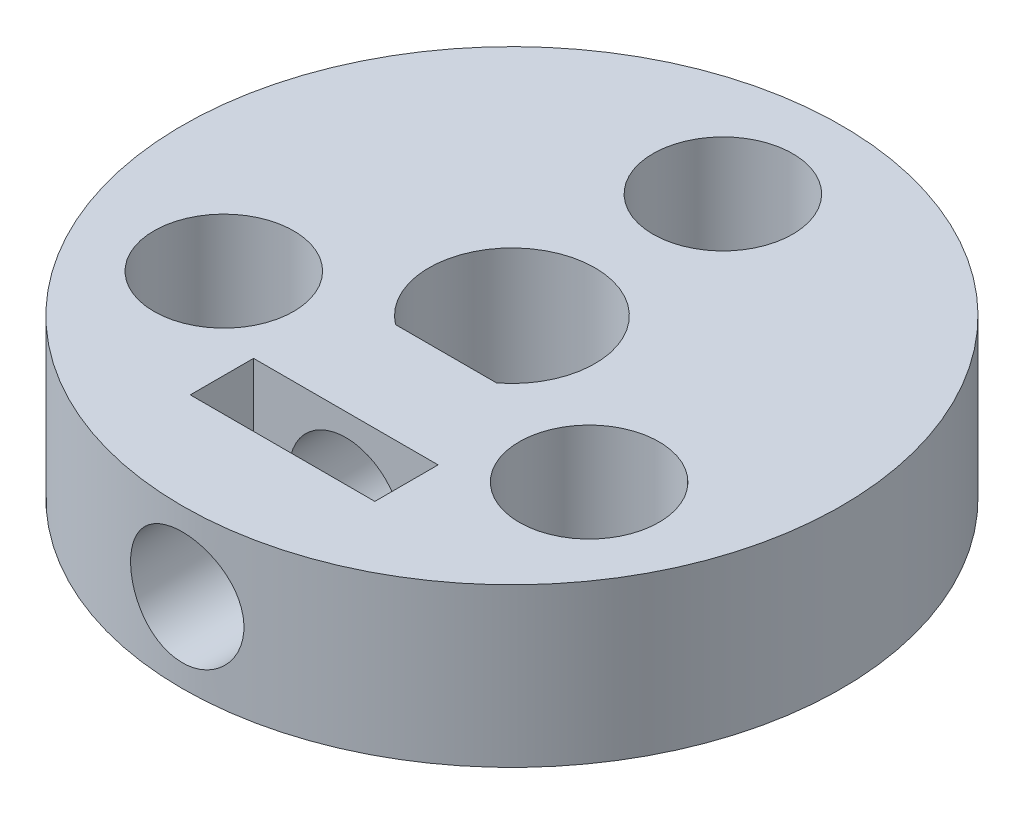
ISO-10303-21;
HEADER;
FILE_DESCRIPTION(('STEP AP214'),'2;1');
FILE_NAME('part.step','',(''),(''),'','','');
FILE_SCHEMA(('AUTOMOTIVE_DESIGN { 1 0 10303 214 1 1 1 1 }'));
ENDSEC;
DATA;
#1=APPLICATION_CONTEXT('core data for automotive mechanical design processes');
#2=APPLICATION_PROTOCOL_DEFINITION('international standard','automotive_design',2000,#1);
#3=PRODUCT_CONTEXT('',#1,'mechanical');
#4=PRODUCT('Part','Part','',(#3));
#5=PRODUCT_RELATED_PRODUCT_CATEGORY('part','',(#4));
#6=PRODUCT_DEFINITION_FORMATION('','',#4);
#7=PRODUCT_DEFINITION_CONTEXT('part definition',#1,'design');
#8=PRODUCT_DEFINITION('design','',#6,#7);
#9=PRODUCT_DEFINITION_SHAPE('','',#8);
#10=(LENGTH_UNIT() NAMED_UNIT(*) SI_UNIT(.MILLI.,.METRE.));
#11=(NAMED_UNIT(*) PLANE_ANGLE_UNIT() SI_UNIT($,.RADIAN.));
#12=(NAMED_UNIT(*) SI_UNIT($,.STERADIAN.) SOLID_ANGLE_UNIT());
#13=UNCERTAINTY_MEASURE_WITH_UNIT(LENGTH_MEASURE(1.E-05),#10,'distance_accuracy_value','');
#14=(GEOMETRIC_REPRESENTATION_CONTEXT(3) GLOBAL_UNCERTAINTY_ASSIGNED_CONTEXT((#13)) GLOBAL_UNIT_ASSIGNED_CONTEXT((#10,
#11,#12)) REPRESENTATION_CONTEXT('',''));
#15=CARTESIAN_POINT('',(0.,0.,0.));
#16=DIRECTION('',(0.,0.,1.));
#17=DIRECTION('',(1.,0.,0.));
#18=AXIS2_PLACEMENT_3D('',#15,#16,#17);
#19=CARTESIAN_POINT('',(0.,-0.00100000000000013,2.5));
#20=DIRECTION('',(0.,0.,1.));
#21=DIRECTION('',(1.,0.,0.));
#22=AXIS2_PLACEMENT_3D('',#19,#20,#21);
#23=PLANE('',#22);
#24=DIRECTION('',(0.,1.,0.));
#25=VECTOR('',#24,1.);
#26=CARTESIAN_POINT('',(1.91637678967368,-0.00100000000000013,2.5));
#27=LINE('',#26,#25);
#28=CARTESIAN_POINT('',(1.91637678967368,3.97467943448089,2.5));
#29=VERTEX_POINT('',#28);
#30=CARTESIAN_POINT('',(1.91637678967368,6.,2.5));
#31=VERTEX_POINT('',#30);
#32=EDGE_CURVE('E123',#29,#31,#27,.T.);
#33=ORIENTED_EDGE('',*,*,#32,.F.);
#34=CARTESIAN_POINT('',(0.,3.,2.5));
#35=DIRECTION('',(0.,0.,-1.));
#36=DIRECTION('',(-1.,0.,0.));
#37=AXIS2_PLACEMENT_3D('',#34,#35,#36);
#38=CIRCLE('',#37,2.15);
#39=CARTESIAN_POINT('',(-1.91637678967368,3.9746794344809,2.5));
#40=VERTEX_POINT('',#39);
#41=EDGE_CURVE('E51',#40,#29,#38,.T.);
#42=ORIENTED_EDGE('',*,*,#41,.F.);
#43=DIRECTION('',(0.,1.,0.));
#44=VECTOR('',#43,1.);
#45=CARTESIAN_POINT('',(-1.91637678967368,-0.00100000000000013,2.5));
#46=LINE('',#45,#44);
#47=CARTESIAN_POINT('',(-1.91637678967368,6.,2.5));
#48=VERTEX_POINT('',#47);
#49=EDGE_CURVE('E111',#40,#48,#46,.T.);
#50=ORIENTED_EDGE('',*,*,#49,.T.);
#51=DIRECTION('',(1.,0.,0.));
#52=VECTOR('',#51,1.);
#53=CARTESIAN_POINT('',(0.,6.,2.5));
#54=LINE('',#53,#52);
#55=EDGE_CURVE('E229',#48,#31,#54,.T.);
#56=ORIENTED_EDGE('',*,*,#55,.T.);
#57=EDGE_LOOP('',(#33,#42,#50,#56));
#58=FACE_BOUND('',#57,.T.);
#59=ADVANCED_FACE('F33',(#58),#23,.F.);
#60=CARTESIAN_POINT('',(0.,6.,0.));
#61=DIRECTION('',(0.,-1.,0.));
#62=DIRECTION('',(0.,0.,-1.));
#63=AXIS2_PLACEMENT_3D('',#60,#61,#62);
#64=CYLINDRICAL_SURFACE('',#63,12.5);
#65=CARTESIAN_POINT('',(0.,0.85,12.5));
#66=CARTESIAN_POINT('',(-0.119818938048779,0.850004752687014,12.4999979114443));
#67=CARTESIAN_POINT('',(-0.239701846511683,0.860050056639606,12.4982593039058));
#68=CARTESIAN_POINT('',(-0.476101420652211,0.899946910501437,12.491491109957));
#69=CARTESIAN_POINT('',(-0.592614954405485,0.929816306623997,12.4864585583007));
#70=CARTESIAN_POINT('',(-0.818821694951854,1.00842956480478,12.4736665733324));
#71=CARTESIAN_POINT('',(-0.928520534822689,1.0571575906141,12.4659094284603));
#72=CARTESIAN_POINT('',(-1.13817229781145,1.17206255172927,12.4485197388435));
#73=CARTESIAN_POINT('',(-1.23812625342234,1.23823763572098,12.4388873931055));
#74=CARTESIAN_POINT('',(-1.42647893397174,1.38687268352683,12.4187046097672));
#75=CARTESIAN_POINT('',(-1.51476435508432,1.46947521774447,12.4081466221823));
#76=CARTESIAN_POINT('',(-1.67629477492968,1.64831354278903,12.3873598586505));
#77=CARTESIAN_POINT('',(-1.74953879345037,1.74455022143025,12.3771311041954));
#78=CARTESIAN_POINT('',(-1.87936560859501,1.9487089080379,12.3580877797128));
#79=CARTESIAN_POINT('',(-1.93583556820356,2.05670365944284,12.3492829609603));
#80=CARTESIAN_POINT('',(-2.02978953302057,2.28082301537608,12.3341895981331));
#81=CARTESIAN_POINT('',(-2.06727490664622,2.39694703325635,12.3279008727042));
#82=CARTESIAN_POINT('',(-2.12183698673275,2.63282466131586,12.3186271072246));
#83=CARTESIAN_POINT('',(-2.13910980770049,2.7525316360637,12.3156103419613));
#84=CARTESIAN_POINT('',(-2.1533646922042,2.99317981132293,12.3131261808314));
#85=CARTESIAN_POINT('',(-2.15034828509413,3.11412091812222,12.313658517442));
#86=CARTESIAN_POINT('',(-2.1242699026492,3.35239924122334,12.3181834664412));
#87=CARTESIAN_POINT('',(-2.10142888991041,3.46976147096293,12.3221379347485));
#88=CARTESIAN_POINT('',(-2.03669673317614,3.69896275984291,12.3330018205107));
#89=CARTESIAN_POINT('',(-1.99480489718698,3.8108016181912,12.3399113453032));
#90=CARTESIAN_POINT('',(-1.89293818144579,4.02643928407376,12.3559476939094));
#91=CARTESIAN_POINT('',(-1.8328721701587,4.1301941796585,12.3650856459418));
#92=CARTESIAN_POINT('',(-1.69642679653225,4.32623591382182,12.3845415999424));
#93=CARTESIAN_POINT('',(-1.62004603401049,4.4185217670157,12.3948597031594));
#94=CARTESIAN_POINT('',(-1.45193849500854,4.59028422588147,12.4156806345561));
#95=CARTESIAN_POINT('',(-1.36002227642989,4.6695754599189,12.4261841020713));
#96=CARTESIAN_POINT('',(-1.1640920178941,4.81163798214303,12.4460664401282));
#97=CARTESIAN_POINT('',(-1.06007789029811,4.87440915064544,12.4554453025222));
#98=CARTESIAN_POINT('',(-0.842725428592676,4.98166910829206,12.4720363094022));
#99=CARTESIAN_POINT('',(-0.729378498234604,5.0261408109136,12.4792464272127));
#100=CARTESIAN_POINT('',(-0.496672426356339,5.09536366328694,12.490671456813));
#101=CARTESIAN_POINT('',(-0.377313821933488,5.12011657145184,12.4948866356713));
#102=CARTESIAN_POINT('',(-0.137569564224754,5.14894625061209,12.4998107499261));
#103=CARTESIAN_POINT('',(-0.0172153530457224,5.15327737664409,12.5005628159094));
#104=CARTESIAN_POINT('',(0.222498602835547,5.14181968715322,12.4985943456318));
#105=CARTESIAN_POINT('',(0.341858388177885,5.12603169795656,12.4958739519908));
#106=CARTESIAN_POINT('',(0.575404467510492,5.0749954893856,12.4872929669083));
#107=CARTESIAN_POINT('',(0.689619244890429,5.03987387874843,12.4814528129077));
#108=CARTESIAN_POINT('',(0.910539548444679,4.95130286957748,12.4672844665643));
#109=CARTESIAN_POINT('',(1.01724463001042,4.8978523869884,12.4589561270622));
#110=CARTESIAN_POINT('',(1.22121669420728,4.77356316316699,12.4406280473418));
#111=CARTESIAN_POINT('',(1.31838601171029,4.70256638481298,12.4306133956183));
#112=CARTESIAN_POINT('',(1.49952237340553,4.54541642508948,12.4100667951649));
#113=CARTESIAN_POINT('',(1.5834883912253,4.45926206653139,12.3995348063026));
#114=CARTESIAN_POINT('',(1.73678335129018,4.27309905095204,12.3790001913158));
#115=CARTESIAN_POINT('',(1.80594000153297,4.17294760637407,12.3690047144901));
#116=CARTESIAN_POINT('',(1.92644787068597,3.96229963257107,12.3508108346765));
#117=CARTESIAN_POINT('',(1.97779967996616,3.8518034465096,12.3426123721067));
#118=CARTESIAN_POINT('',(2.06098575423572,3.62407341398739,12.3289950368685));
#119=CARTESIAN_POINT('',(2.09290410737786,3.50687103122586,12.323564205605));
#120=CARTESIAN_POINT('',(2.13658064561922,3.26866666916193,12.3160676658646));
#121=CARTESIAN_POINT('',(2.14834070917861,3.1476650449639,12.3140016438372));
#122=CARTESIAN_POINT('',(2.151311863105,2.9070186830601,12.3134827549156));
#123=CARTESIAN_POINT('',(2.1427942767621,2.78737731214552,12.3149821805493));
#124=CARTESIAN_POINT('',(2.10604040115662,2.55125752417974,12.3213203811202));
#125=CARTESIAN_POINT('',(2.07780418808119,2.43477909490964,12.3261591431552));
#126=CARTESIAN_POINT('',(2.00252116224137,2.20840660116172,12.3386121930928));
#127=CARTESIAN_POINT('',(1.95549919486392,2.09850405951004,12.3462228138611));
#128=CARTESIAN_POINT('',(1.84400771219254,1.88810396089793,12.3633653510631));
#129=CARTESIAN_POINT('',(1.77953723982211,1.78760692025032,12.3728973728813));
#130=CARTESIAN_POINT('',(1.63401660649154,1.59750256696573,12.392959176191));
#131=CARTESIAN_POINT('',(1.55276734360893,1.50804880872563,12.4035000380881));
#132=CARTESIAN_POINT('',(1.37641436848876,1.34395270052591,12.4243048284332));
#133=CARTESIAN_POINT('',(1.28130746866679,1.2693137676831,12.4345686925196));
#134=CARTESIAN_POINT('',(1.07909994999619,1.13645785031136,12.4537514042708));
#135=CARTESIAN_POINT('',(0.971915736072662,1.07836655756485,12.4626597297496));
#136=CARTESIAN_POINT('',(0.74919807904286,0.981104635367544,12.4780252515746));
#137=CARTESIAN_POINT('',(0.63367296518508,0.941915422646104,12.4844848539993));
#138=CARTESIAN_POINT('',(0.431437089625144,0.891942670496806,12.4928380050209));
#139=CARTESIAN_POINT('',(0.345940294406008,0.876239766035062,12.4955092009256));
#140=CARTESIAN_POINT('',(0.173640182774156,0.855266807971771,12.4990909384638));
#141=CARTESIAN_POINT('',(0.0868368912898941,0.849996555564819,12.5000015136479));
#142=CARTESIAN_POINT('',(0.,0.85,12.5));
#143=B_SPLINE_CURVE_WITH_KNOTS('',3,(#65,#66,#67,#68,#69,#70,#71,#72,#73,#74,#75,#76,#77,#78,
#79,#80,#81,#82,#83,#84,#85,#86,#87,#88,#89,#90,#91,#92,#93,#94,#95,#96,#97,#98,#99,#100,#101,
#102,#103,#104,#105,#106,#107,#108,#109,#110,#111,#112,#113,#114,#115,#116,#117,#118,#119,#120,
#121,#122,#123,#124,#125,#126,#127,#128,#129,#130,#131,#132,#133,#134,#135,#136,#137,#138,#139,
#140,#141,#142),.UNSPECIFIED.,.T.,.F.,(4,2,2,2,2,2,2,2,2,2,2,2,2,2,2,2,2,2,2,2,2,2,2,2,2,2,2,2,
2,2,2,2,2,2,2,2,2,2,4),(0.,0.359139363177399,0.718602473184186,1.07776438215042,
1.43688819563414,1.79927665334872,2.16168871956046,2.52648617628577,2.89125733450818,
3.25245911829622,3.61363367585415,3.97083358281946,4.32804646559289,4.68708108588645,
5.04614653203138,5.40995658005713,5.77376926373561,6.13792087887562,6.50204001735114,
6.86161182444243,7.22116886378515,7.57839883498795,7.93564993808881,8.29624416587643,
8.65686641099512,9.02148008783919,9.38608167372684,9.74909421163323,10.1120729201978,
10.4702221790395,10.8283700541022,11.1860458150377,11.5437411989994,11.9059539068814,
12.268250064176,12.6332289108705,12.9978481994693,13.2581337658101,13.5184143720817),.UNSPECIFIED.);
#144=CARTESIAN_POINT('',(0.,0.85,12.5));
#145=VERTEX_POINT('',#144);
#146=EDGE_CURVE('E190',#145,#145,#143,.T.);
#147=ORIENTED_EDGE('',*,*,#146,.T.);
#148=EDGE_LOOP('',(#147));
#149=FACE_BOUND('',#148,.T.);
#150=CARTESIAN_POINT('',(0.,6.,0.));
#151=DIRECTION('',(0.,1.,0.));
#152=DIRECTION('',(0.,0.,1.));
#153=AXIS2_PLACEMENT_3D('',#150,#151,#152);
#154=CIRCLE('',#153,12.5);
#155=CARTESIAN_POINT('',(0.,6.,12.5));
#156=VERTEX_POINT('',#155);
#157=EDGE_CURVE('E11',#156,#156,#154,.T.);
#158=ORIENTED_EDGE('',*,*,#157,.F.);
#159=EDGE_LOOP('',(#158));
#160=FACE_BOUND('',#159,.T.);
#161=CARTESIAN_POINT('',(0.,0.,0.));
#162=DIRECTION('',(0.,1.,0.));
#163=DIRECTION('',(0.,0.,1.));
#164=AXIS2_PLACEMENT_3D('',#161,#162,#163);
#165=CIRCLE('',#164,12.5);
#166=CARTESIAN_POINT('',(0.,0.,12.5));
#167=VERTEX_POINT('',#166);
#168=EDGE_CURVE('E43',#167,#167,#165,.T.);
#169=ORIENTED_EDGE('',*,*,#168,.T.);
#170=EDGE_LOOP('',(#169));
#171=FACE_BOUND('',#170,.T.);
#172=ADVANCED_FACE('F35',(#149,#160,#171),#64,.T.);
#173=CARTESIAN_POINT('',(0.,6.,0.));
#174=DIRECTION('',(0.,1.,0.));
#175=DIRECTION('',(0.,0.,1.));
#176=AXIS2_PLACEMENT_3D('',#173,#174,#175);
#177=PLANE('',#176);
#178=CARTESIAN_POINT('',(0.,6.,-8.));
#179=DIRECTION('',(0.,1.,0.));
#180=DIRECTION('',(0.,0.,1.));
#181=AXIS2_PLACEMENT_3D('',#178,#179,#180);
#182=CIRCLE('',#181,2.65);
#183=CARTESIAN_POINT('',(0.,6.,-5.35));
#184=VERTEX_POINT('',#183);
#185=EDGE_CURVE('E245',#184,#184,#182,.T.);
#186=ORIENTED_EDGE('',*,*,#185,.F.);
#187=EDGE_LOOP('',(#186));
#188=FACE_BOUND('',#187,.T.);
#189=CARTESIAN_POINT('',(6.92820323027585,6.,3.9999999999998));
#190=DIRECTION('',(0.,1.,0.));
#191=DIRECTION('',(0.,0.,1.));
#192=AXIS2_PLACEMENT_3D('',#189,#190,#191);
#193=CIRCLE('',#192,2.6500000000003);
#194=CARTESIAN_POINT('',(6.92820323027585,6.,6.65000000000011));
#195=VERTEX_POINT('',#194);
#196=EDGE_CURVE('E239',#195,#195,#193,.T.);
#197=ORIENTED_EDGE('',*,*,#196,.F.);
#198=EDGE_LOOP('',(#197));
#199=FACE_BOUND('',#198,.T.);
#200=CARTESIAN_POINT('',(-6.92820323027517,6.,4.0000000000002));
#201=DIRECTION('',(0.,1.,0.));
#202=DIRECTION('',(0.,0.,1.));
#203=AXIS2_PLACEMENT_3D('',#200,#201,#202);
#204=CIRCLE('',#203,2.65000000000045);
#205=CARTESIAN_POINT('',(-6.92820323027517,6.,6.65000000000065));
#206=VERTEX_POINT('',#205);
#207=EDGE_CURVE('E233',#206,#206,#204,.T.);
#208=ORIENTED_EDGE('',*,*,#207,.F.);
#209=EDGE_LOOP('',(#208));
#210=FACE_BOUND('',#209,.T.);
#211=DIRECTION('',(0.,0.,-1.));
#212=VECTOR('',#211,1.);
#213=CARTESIAN_POINT('',(3.5,6.,8.7));
#214=LINE('',#213,#212);
#215=CARTESIAN_POINT('',(3.5,6.,8.7));
#216=VERTEX_POINT('',#215);
#217=CARTESIAN_POINT('',(3.5,6.,6.3));
#218=VERTEX_POINT('',#217);
#219=EDGE_CURVE('E59',#216,#218,#214,.T.);
#220=ORIENTED_EDGE('',*,*,#219,.F.);
#221=DIRECTION('',(1.,0.,0.));
#222=VECTOR('',#221,1.);
#223=CARTESIAN_POINT('',(-3.5,6.,8.7));
#224=LINE('',#223,#222);
#225=CARTESIAN_POINT('',(-3.5,6.,8.7));
#226=VERTEX_POINT('',#225);
#227=EDGE_CURVE('E213',#226,#216,#224,.T.);
#228=ORIENTED_EDGE('',*,*,#227,.F.);
#229=DIRECTION('',(0.,0.,1.));
#230=VECTOR('',#229,1.);
#231=CARTESIAN_POINT('',(-3.5,6.,8.7));
#232=LINE('',#231,#230);
#233=CARTESIAN_POINT('',(-3.5,6.,6.3));
#234=VERTEX_POINT('',#233);
#235=EDGE_CURVE('E210',#234,#226,#232,.T.);
#236=ORIENTED_EDGE('',*,*,#235,.F.);
#237=DIRECTION('',(-1.,0.,0.));
#238=VECTOR('',#237,1.);
#239=CARTESIAN_POINT('',(-3.5,6.,6.3));
#240=LINE('',#239,#238);
#241=EDGE_CURVE('E207',#218,#234,#240,.T.);
#242=ORIENTED_EDGE('',*,*,#241,.F.);
#243=EDGE_LOOP('',(#220,#228,#236,#242));
#244=FACE_BOUND('',#243,.T.);
#245=ORIENTED_EDGE('',*,*,#55,.F.);
#246=CARTESIAN_POINT('',(0.,6.,0.));
#247=DIRECTION('',(0.,1.,0.));
#248=DIRECTION('',(0.,0.,1.));
#249=AXIS2_PLACEMENT_3D('',#246,#247,#248);
#250=CIRCLE('',#249,3.15);
#251=EDGE_CURVE('E129',#31,#48,#250,.T.);
#252=ORIENTED_EDGE('',*,*,#251,.F.);
#253=EDGE_LOOP('',(#245,#252));
#254=FACE_BOUND('',#253,.T.);
#255=ORIENTED_EDGE('',*,*,#157,.T.);
#256=EDGE_LOOP('',(#255));
#257=FACE_BOUND('',#256,.T.);
#258=ADVANCED_FACE('F148',(#188,#199,#210,#244,#254,#257),#177,.T.);
#259=CARTESIAN_POINT('',(0.,0.,0.));
#260=DIRECTION('',(0.,1.,0.));
#261=DIRECTION('',(0.,0.,1.));
#262=AXIS2_PLACEMENT_3D('',#259,#260,#261);
#263=PLANE('',#262);
#264=CARTESIAN_POINT('',(0.,0.,-8.));
#265=DIRECTION('',(0.,1.,0.));
#266=DIRECTION('',(0.,0.,1.));
#267=AXIS2_PLACEMENT_3D('',#264,#265,#266);
#268=CIRCLE('',#267,2.65);
#269=CARTESIAN_POINT('',(0.,0.,-5.35));
#270=VERTEX_POINT('',#269);
#271=EDGE_CURVE('E117',#270,#270,#268,.T.);
#272=ORIENTED_EDGE('',*,*,#271,.T.);
#273=EDGE_LOOP('',(#272));
#274=FACE_BOUND('',#273,.T.);
#275=CARTESIAN_POINT('',(6.92820323027585,0.,3.9999999999998));
#276=DIRECTION('',(0.,1.,0.));
#277=DIRECTION('',(0.,0.,1.));
#278=AXIS2_PLACEMENT_3D('',#275,#276,#277);
#279=CIRCLE('',#278,2.6500000000003);
#280=CARTESIAN_POINT('',(6.92820323027585,0.,6.65000000000011));
#281=VERTEX_POINT('',#280);
#282=EDGE_CURVE('E242',#281,#281,#279,.T.);
#283=ORIENTED_EDGE('',*,*,#282,.T.);
#284=EDGE_LOOP('',(#283));
#285=FACE_BOUND('',#284,.T.);
#286=CARTESIAN_POINT('',(-6.92820323027517,0.,4.0000000000002));
#287=DIRECTION('',(0.,1.,0.));
#288=DIRECTION('',(0.,0.,1.));
#289=AXIS2_PLACEMENT_3D('',#286,#287,#288);
#290=CIRCLE('',#289,2.65000000000045);
#291=CARTESIAN_POINT('',(-6.92820323027517,0.,6.65000000000065));
#292=VERTEX_POINT('',#291);
#293=EDGE_CURVE('E236',#292,#292,#290,.T.);
#294=ORIENTED_EDGE('',*,*,#293,.T.);
#295=EDGE_LOOP('',(#294));
#296=FACE_BOUND('',#295,.T.);
#297=DIRECTION('',(-1.,0.,0.));
#298=VECTOR('',#297,1.);
#299=CARTESIAN_POINT('',(-3.5,0.,8.7));
#300=LINE('',#299,#298);
#301=CARTESIAN_POINT('',(3.5,0.,8.7));
#302=VERTEX_POINT('',#301);
#303=CARTESIAN_POINT('',(-3.5,0.,8.7));
#304=VERTEX_POINT('',#303);
#305=EDGE_CURVE('E200',#302,#304,#300,.T.);
#306=ORIENTED_EDGE('',*,*,#305,.F.);
#307=DIRECTION('',(0.,0.,1.));
#308=VECTOR('',#307,1.);
#309=CARTESIAN_POINT('',(3.5,0.,8.7));
#310=LINE('',#309,#308);
#311=CARTESIAN_POINT('',(3.5,0.,6.3));
#312=VERTEX_POINT('',#311);
#313=EDGE_CURVE('E203',#312,#302,#310,.T.);
#314=ORIENTED_EDGE('',*,*,#313,.F.);
#315=DIRECTION('',(1.,0.,0.));
#316=VECTOR('',#315,1.);
#317=CARTESIAN_POINT('',(-3.5,0.,6.3));
#318=LINE('',#317,#316);
#319=CARTESIAN_POINT('',(-3.5,0.,6.3));
#320=VERTEX_POINT('',#319);
#321=EDGE_CURVE('E219',#320,#312,#318,.T.);
#322=ORIENTED_EDGE('',*,*,#321,.F.);
#323=DIRECTION('',(0.,0.,-1.));
#324=VECTOR('',#323,1.);
#325=CARTESIAN_POINT('',(-3.5,0.,8.7));
#326=LINE('',#325,#324);
#327=EDGE_CURVE('E197',#304,#320,#326,.T.);
#328=ORIENTED_EDGE('',*,*,#327,.F.);
#329=EDGE_LOOP('',(#306,#314,#322,#328));
#330=FACE_BOUND('',#329,.T.);
#331=CARTESIAN_POINT('',(0.,0.,0.));
#332=DIRECTION('',(0.,1.,0.));
#333=DIRECTION('',(0.,0.,1.));
#334=AXIS2_PLACEMENT_3D('',#331,#332,#333);
#335=CIRCLE('',#334,3.15);
#336=CARTESIAN_POINT('',(-1.91637678967368,0.,2.5));
#337=VERTEX_POINT('',#336);
#338=CARTESIAN_POINT('',(1.91637678967368,0.,2.5));
#339=VERTEX_POINT('',#338);
#340=EDGE_CURVE('E136',#337,#339,#335,.F.);
#341=ORIENTED_EDGE('',*,*,#340,.F.);
#342=DIRECTION('',(-1.,0.,0.));
#343=VECTOR('',#342,1.);
#344=CARTESIAN_POINT('',(0.,0.,2.5));
#345=LINE('',#344,#343);
#346=EDGE_CURVE('E227',#339,#337,#345,.T.);
#347=ORIENTED_EDGE('',*,*,#346,.F.);
#348=EDGE_LOOP('',(#341,#347));
#349=FACE_BOUND('',#348,.T.);
#350=ORIENTED_EDGE('',*,*,#168,.F.);
#351=EDGE_LOOP('',(#350));
#352=FACE_BOUND('',#351,.T.);
#353=ADVANCED_FACE('F145',(#274,#285,#296,#330,#349,#352),#263,.F.);
#354=CARTESIAN_POINT('',(-1.91637678967368,2.0253205655191,2.5));
#355=VERTEX_POINT('',#354);
#356=EDGE_CURVE('E110',#337,#355,#46,.T.);
#357=ORIENTED_EDGE('',*,*,#356,.T.);
#358=CARTESIAN_POINT('',(1.91637678967368,2.0253205655191,2.5));
#359=VERTEX_POINT('',#358);
#360=EDGE_CURVE('E116',#359,#355,#38,.T.);
#361=ORIENTED_EDGE('',*,*,#360,.F.);
#362=EDGE_CURVE('E131',#339,#359,#27,.T.);
#363=ORIENTED_EDGE('',*,*,#362,.F.);
#364=ORIENTED_EDGE('',*,*,#346,.T.);
#365=EDGE_LOOP('',(#357,#361,#363,#364));
#366=FACE_BOUND('',#365,.T.);
#367=ADVANCED_FACE('F147',(#366),#23,.F.);
#368=CARTESIAN_POINT('',(0.,-0.00100000000000013,0.));
#369=DIRECTION('',(0.,1.,0.));
#370=DIRECTION('',(0.,0.,1.));
#371=AXIS2_PLACEMENT_3D('',#368,#369,#370);
#372=CYLINDRICAL_SURFACE('',#371,3.15);
#373=ORIENTED_EDGE('',*,*,#340,.T.);
#374=ORIENTED_EDGE('',*,*,#362,.T.);
#375=EDGE_CURVE('E133',#359,#29,#27,.T.);
#376=ORIENTED_EDGE('',*,*,#375,.T.);
#377=ORIENTED_EDGE('',*,*,#32,.T.);
#378=ORIENTED_EDGE('',*,*,#251,.T.);
#379=ORIENTED_EDGE('',*,*,#49,.F.);
#380=EDGE_CURVE('E102',#355,#40,#46,.T.);
#381=ORIENTED_EDGE('',*,*,#380,.F.);
#382=ORIENTED_EDGE('',*,*,#356,.F.);
#383=EDGE_LOOP('',(#373,#374,#376,#377,#378,#379,#381,#382));
#384=FACE_BOUND('',#383,.T.);
#385=ADVANCED_FACE('F127',(#384),#372,.F.);
#386=CARTESIAN_POINT('',(3.5,-0.00100000000000013,8.7));
#387=DIRECTION('',(1.,0.,0.));
#388=DIRECTION('',(0.,0.,-1.));
#389=AXIS2_PLACEMENT_3D('',#386,#387,#388);
#390=PLANE('',#389);
#391=ORIENTED_EDGE('',*,*,#313,.T.);
#392=DIRECTION('',(0.,1.,0.));
#393=VECTOR('',#392,1.);
#394=CARTESIAN_POINT('',(3.5,-0.00100000000000013,8.7));
#395=LINE('',#394,#393);
#396=EDGE_CURVE('E217',#302,#216,#395,.T.);
#397=ORIENTED_EDGE('',*,*,#396,.T.);
#398=ORIENTED_EDGE('',*,*,#219,.T.);
#399=DIRECTION('',(0.,1.,0.));
#400=VECTOR('',#399,1.);
#401=CARTESIAN_POINT('',(3.5,-0.00100000000000013,6.3));
#402=LINE('',#401,#400);
#403=EDGE_CURVE('E216',#312,#218,#402,.T.);
#404=ORIENTED_EDGE('',*,*,#403,.F.);
#405=EDGE_LOOP('',(#391,#397,#398,#404));
#406=FACE_BOUND('',#405,.T.);
#407=ADVANCED_FACE('F167',(#406),#390,.F.);
#408=CARTESIAN_POINT('',(-3.5,-0.00100000000000013,8.7));
#409=DIRECTION('',(0.,0.,1.));
#410=DIRECTION('',(1.,0.,0.));
#411=AXIS2_PLACEMENT_3D('',#408,#409,#410);
#412=PLANE('',#411);
#413=CARTESIAN_POINT('',(0.,3.,8.7));
#414=DIRECTION('',(0.,0.,1.));
#415=DIRECTION('',(1.,0.,0.));
#416=AXIS2_PLACEMENT_3D('',#413,#414,#415);
#417=CIRCLE('',#416,2.15);
#418=CARTESIAN_POINT('',(2.15,3.,8.7));
#419=VERTEX_POINT('',#418);
#420=EDGE_CURVE('E198',#419,#419,#417,.T.);
#421=ORIENTED_EDGE('',*,*,#420,.T.);
#422=EDGE_LOOP('',(#421));
#423=FACE_BOUND('',#422,.T.);
#424=ORIENTED_EDGE('',*,*,#305,.T.);
#425=DIRECTION('',(0.,1.,0.));
#426=VECTOR('',#425,1.);
#427=CARTESIAN_POINT('',(-3.5,-0.00100000000000013,8.7));
#428=LINE('',#427,#426);
#429=EDGE_CURVE('E220',#304,#226,#428,.T.);
#430=ORIENTED_EDGE('',*,*,#429,.T.);
#431=ORIENTED_EDGE('',*,*,#227,.T.);
#432=ORIENTED_EDGE('',*,*,#396,.F.);
#433=EDGE_LOOP('',(#424,#430,#431,#432));
#434=FACE_BOUND('',#433,.T.);
#435=ADVANCED_FACE('F170',(#423,#434),#412,.F.);
#436=CARTESIAN_POINT('',(-3.5,-0.00100000000000013,8.7));
#437=DIRECTION('',(-1.,0.,0.));
#438=DIRECTION('',(0.,0.,1.));
#439=AXIS2_PLACEMENT_3D('',#436,#437,#438);
#440=PLANE('',#439);
#441=ORIENTED_EDGE('',*,*,#327,.T.);
#442=DIRECTION('',(0.,1.,0.));
#443=VECTOR('',#442,1.);
#444=CARTESIAN_POINT('',(-3.5,-0.00100000000000013,6.3));
#445=LINE('',#444,#443);
#446=EDGE_CURVE('E222',#320,#234,#445,.T.);
#447=ORIENTED_EDGE('',*,*,#446,.T.);
#448=ORIENTED_EDGE('',*,*,#235,.T.);
#449=ORIENTED_EDGE('',*,*,#429,.F.);
#450=EDGE_LOOP('',(#441,#447,#448,#449));
#451=FACE_BOUND('',#450,.T.);
#452=ADVANCED_FACE('F174',(#451),#440,.F.);
#453=CARTESIAN_POINT('',(-3.5,-0.00100000000000013,6.3));
#454=DIRECTION('',(0.,0.,-1.));
#455=DIRECTION('',(-1.,0.,0.));
#456=AXIS2_PLACEMENT_3D('',#453,#454,#455);
#457=PLANE('',#456);
#458=CARTESIAN_POINT('',(0.,3.,6.3));
#459=DIRECTION('',(0.,0.,-1.));
#460=DIRECTION('',(-1.,0.,0.));
#461=AXIS2_PLACEMENT_3D('',#458,#459,#460);
#462=CIRCLE('',#461,2.15);
#463=CARTESIAN_POINT('',(-2.15,3.,6.3));
#464=VERTEX_POINT('',#463);
#465=EDGE_CURVE('E38',#464,#464,#462,.T.);
#466=ORIENTED_EDGE('',*,*,#465,.T.);
#467=EDGE_LOOP('',(#466));
#468=FACE_BOUND('',#467,.T.);
#469=ORIENTED_EDGE('',*,*,#321,.T.);
#470=ORIENTED_EDGE('',*,*,#403,.T.);
#471=ORIENTED_EDGE('',*,*,#241,.T.);
#472=ORIENTED_EDGE('',*,*,#446,.F.);
#473=EDGE_LOOP('',(#469,#470,#471,#472));
#474=FACE_BOUND('',#473,.T.);
#475=ADVANCED_FACE('F171',(#468,#474),#457,.F.);
#476=CARTESIAN_POINT('',(0.,3.,12.5));
#477=DIRECTION('',(0.,0.,-1.));
#478=DIRECTION('',(-1.,0.,0.));
#479=AXIS2_PLACEMENT_3D('',#476,#477,#478);
#480=CYLINDRICAL_SURFACE('',#479,2.15);
#481=ORIENTED_EDGE('',*,*,#41,.T.);
#482=EDGE_CURVE('E125',#29,#359,#38,.T.);
#483=ORIENTED_EDGE('',*,*,#482,.T.);
#484=ORIENTED_EDGE('',*,*,#360,.T.);
#485=EDGE_CURVE('E104',#355,#40,#38,.T.);
#486=ORIENTED_EDGE('',*,*,#485,.T.);
#487=EDGE_LOOP('',(#481,#483,#484,#486));
#488=FACE_BOUND('',#487,.T.);
#489=ORIENTED_EDGE('',*,*,#465,.F.);
#490=EDGE_LOOP('',(#489));
#491=FACE_BOUND('',#490,.T.);
#492=ADVANCED_FACE('F113',(#488,#491),#480,.F.);
#493=CARTESIAN_POINT('',(0.,3.,2.5));
#494=DIRECTION('',(0.,0.,-1.));
#495=DIRECTION('',(-1.,0.,0.));
#496=AXIS2_PLACEMENT_3D('',#493,#494,#495);
#497=PLANE('',#496);
#498=ORIENTED_EDGE('',*,*,#482,.F.);
#499=ORIENTED_EDGE('',*,*,#375,.F.);
#500=EDGE_LOOP('',(#498,#499));
#501=FACE_BOUND('',#500,.T.);
#502=ADVANCED_FACE('F231',(#501),#497,.F.);
#503=ORIENTED_EDGE('',*,*,#485,.F.);
#504=ORIENTED_EDGE('',*,*,#380,.T.);
#505=EDGE_LOOP('',(#503,#504));
#506=FACE_BOUND('',#505,.T.);
#507=ADVANCED_FACE('F103',(#506),#497,.F.);
#508=ORIENTED_EDGE('',*,*,#420,.F.);
#509=EDGE_LOOP('',(#508));
#510=FACE_BOUND('',#509,.T.);
#511=ORIENTED_EDGE('',*,*,#146,.F.);
#512=EDGE_LOOP('',(#511));
#513=FACE_BOUND('',#512,.T.);
#514=ADVANCED_FACE('F182',(#510,#513),#480,.F.);
#515=CARTESIAN_POINT('',(-6.92820323027517,0.,4.0000000000002));
#516=DIRECTION('',(0.,1.,0.));
#517=DIRECTION('',(0.,0.,1.));
#518=AXIS2_PLACEMENT_3D('',#515,#516,#517);
#519=CYLINDRICAL_SURFACE('',#518,2.65000000000045);
#520=ORIENTED_EDGE('',*,*,#293,.F.);
#521=EDGE_LOOP('',(#520));
#522=FACE_BOUND('',#521,.T.);
#523=ORIENTED_EDGE('',*,*,#207,.T.);
#524=EDGE_LOOP('',(#523));
#525=FACE_BOUND('',#524,.T.);
#526=ADVANCED_FACE('F186',(#522,#525),#519,.F.);
#527=CARTESIAN_POINT('',(6.92820323027585,0.,3.9999999999998));
#528=DIRECTION('',(0.,1.,0.));
#529=DIRECTION('',(0.,0.,1.));
#530=AXIS2_PLACEMENT_3D('',#527,#528,#529);
#531=CYLINDRICAL_SURFACE('',#530,2.6500000000003);
#532=ORIENTED_EDGE('',*,*,#282,.F.);
#533=EDGE_LOOP('',(#532));
#534=FACE_BOUND('',#533,.T.);
#535=ORIENTED_EDGE('',*,*,#196,.T.);
#536=EDGE_LOOP('',(#535));
#537=FACE_BOUND('',#536,.T.);
#538=ADVANCED_FACE('F253',(#534,#537),#531,.F.);
#539=CARTESIAN_POINT('',(0.,0.,-8.));
#540=DIRECTION('',(0.,1.,0.));
#541=DIRECTION('',(0.,0.,1.));
#542=AXIS2_PLACEMENT_3D('',#539,#540,#541);
#543=CYLINDRICAL_SURFACE('',#542,2.65);
#544=ORIENTED_EDGE('',*,*,#271,.F.);
#545=EDGE_LOOP('',(#544));
#546=FACE_BOUND('',#545,.T.);
#547=ORIENTED_EDGE('',*,*,#185,.T.);
#548=EDGE_LOOP('',(#547));
#549=FACE_BOUND('',#548,.T.);
#550=ADVANCED_FACE('F250',(#546,#549),#543,.F.);
#551=CLOSED_SHELL('',(#59,#172,#258,#353,#367,#385,#407,#435,#452,#475,#492,#502,#507,#514,#526,
#538,#550));
#552=MANIFOLD_SOLID_BREP('B2',#551);
#553=ADVANCED_BREP_SHAPE_REPRESENTATION('',(#18,#552),#14);
#554=SHAPE_DEFINITION_REPRESENTATION(#9,#553);
ENDSEC;
END-ISO-10303-21;
